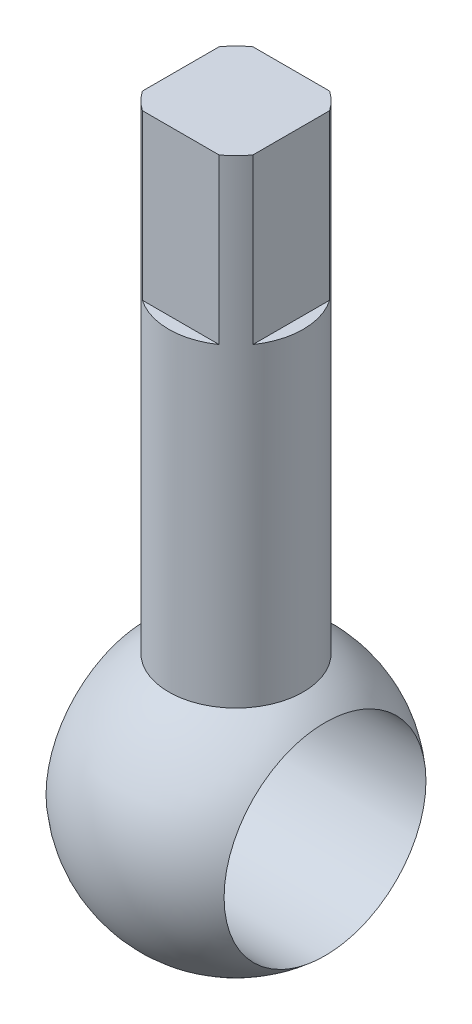
ISO-10303-21;
HEADER;
FILE_DESCRIPTION(('STEP AP214'),'2;1');
FILE_NAME('part.step','',(''),(''),'','','');
FILE_SCHEMA(('AUTOMOTIVE_DESIGN { 1 0 10303 214 1 1 1 1 }'));
ENDSEC;
DATA;
#1=APPLICATION_CONTEXT('core data for automotive mechanical design processes');
#2=APPLICATION_PROTOCOL_DEFINITION('international standard','automotive_design',2000,#1);
#3=PRODUCT_CONTEXT('',#1,'mechanical');
#4=PRODUCT('Part','Part','',(#3));
#5=PRODUCT_RELATED_PRODUCT_CATEGORY('part','',(#4));
#6=PRODUCT_DEFINITION_FORMATION('','',#4);
#7=PRODUCT_DEFINITION_CONTEXT('part definition',#1,'design');
#8=PRODUCT_DEFINITION('design','',#6,#7);
#9=PRODUCT_DEFINITION_SHAPE('','',#8);
#10=(LENGTH_UNIT() NAMED_UNIT(*) SI_UNIT(.MILLI.,.METRE.));
#11=(NAMED_UNIT(*) PLANE_ANGLE_UNIT() SI_UNIT($,.RADIAN.));
#12=(NAMED_UNIT(*) SI_UNIT($,.STERADIAN.) SOLID_ANGLE_UNIT());
#13=UNCERTAINTY_MEASURE_WITH_UNIT(LENGTH_MEASURE(1.E-05),#10,'distance_accuracy_value','');
#14=(GEOMETRIC_REPRESENTATION_CONTEXT(3) GLOBAL_UNCERTAINTY_ASSIGNED_CONTEXT((#13)) GLOBAL_UNIT_ASSIGNED_CONTEXT((#10,
#11,#12)) REPRESENTATION_CONTEXT('',''));
#15=CARTESIAN_POINT('',(0.,0.,0.));
#16=DIRECTION('',(0.,0.,1.));
#17=DIRECTION('',(1.,0.,0.));
#18=AXIS2_PLACEMENT_3D('',#15,#16,#17);
#19=CARTESIAN_POINT('',(0.,25.4,0.));
#20=DIRECTION('',(0.,-1.,0.));
#21=DIRECTION('',(-1.,0.,0.));
#22=AXIS2_PLACEMENT_3D('',#19,#20,#21);
#23=SPHERICAL_SURFACE('',#22,25.4);
#24=CARTESIAN_POINT('',(16.8005208252601,25.4,0.));
#25=DIRECTION('',(-1.,0.,0.));
#26=DIRECTION('',(0.,0.,1.));
#27=AXIS2_PLACEMENT_3D('',#24,#25,#26);
#28=CIRCLE('',#27,19.05);
#29=CARTESIAN_POINT('',(16.8005208252601,25.4,19.05));
#30=VERTEX_POINT('',#29);
#31=EDGE_CURVE('E37',#30,#30,#28,.T.);
#32=ORIENTED_EDGE('',*,*,#31,.T.);
#33=EDGE_LOOP('',(#32));
#34=FACE_BOUND('',#33,.T.);
#35=CARTESIAN_POINT('',(-16.8005208252601,25.4,0.));
#36=DIRECTION('',(1.,0.,0.));
#37=DIRECTION('',(0.,0.,-1.));
#38=AXIS2_PLACEMENT_3D('',#35,#36,#37);
#39=CIRCLE('',#38,19.05);
#40=CARTESIAN_POINT('',(-16.8005208252601,25.4,-19.05));
#41=VERTEX_POINT('',#40);
#42=EDGE_CURVE('E118',#41,#41,#39,.T.);
#43=ORIENTED_EDGE('',*,*,#42,.T.);
#44=EDGE_LOOP('',(#43));
#45=FACE_BOUND('',#44,.T.);
#46=CARTESIAN_POINT('',(0.,47.3970452561247,0.));
#47=DIRECTION('',(0.,-1.,0.));
#48=DIRECTION('',(0.,0.,-1.));
#49=AXIS2_PLACEMENT_3D('',#46,#47,#48);
#50=CIRCLE('',#49,12.7);
#51=CARTESIAN_POINT('',(0.,47.3970452561247,-12.7));
#52=VERTEX_POINT('',#51);
#53=EDGE_CURVE('E153',#52,#52,#50,.T.);
#54=ORIENTED_EDGE('',*,*,#53,.T.);
#55=EDGE_LOOP('',(#54));
#56=FACE_BOUND('',#55,.T.);
#57=ADVANCED_FACE('F34',(#34,#45,#56),#23,.T.);
#58=CARTESIAN_POINT('',(0.,137.668,0.));
#59=DIRECTION('',(0.,-1.,0.));
#60=DIRECTION('',(0.,0.,-1.));
#61=AXIS2_PLACEMENT_3D('',#58,#59,#60);
#62=PLANE('',#61);
#63=CARTESIAN_POINT('',(0.,137.668,0.));
#64=DIRECTION('',(0.,-1.,0.));
#65=DIRECTION('',(0.,0.,-1.));
#66=AXIS2_PLACEMENT_3D('',#63,#64,#65);
#67=CIRCLE('',#66,12.7);
#68=CARTESIAN_POINT('',(-7.239,137.668,10.4348875892364));
#69=VERTEX_POINT('',#68);
#70=CARTESIAN_POINT('',(-10.4348875892364,137.668,7.239));
#71=VERTEX_POINT('',#70);
#72=EDGE_CURVE('E186',#69,#71,#67,.T.);
#73=ORIENTED_EDGE('',*,*,#72,.F.);
#74=DIRECTION('',(-1.,0.,0.));
#75=VECTOR('',#74,1.);
#76=CARTESIAN_POINT('',(-7.239,137.668,10.4348875892364));
#77=LINE('',#76,#75);
#78=CARTESIAN_POINT('',(7.239,137.668,10.4348875892364));
#79=VERTEX_POINT('',#78);
#80=EDGE_CURVE('E104',#79,#69,#77,.T.);
#81=ORIENTED_EDGE('',*,*,#80,.F.);
#82=CARTESIAN_POINT('',(10.4348875892364,137.668,7.239));
#83=VERTEX_POINT('',#82);
#84=EDGE_CURVE('E42',#83,#79,#67,.T.);
#85=ORIENTED_EDGE('',*,*,#84,.F.);
#86=DIRECTION('',(0.,0.,1.));
#87=VECTOR('',#86,1.);
#88=CARTESIAN_POINT('',(10.4348875892364,137.668,-7.239));
#89=LINE('',#88,#87);
#90=CARTESIAN_POINT('',(10.4348875892364,137.668,-7.239));
#91=VERTEX_POINT('',#90);
#92=EDGE_CURVE('E147',#91,#83,#89,.T.);
#93=ORIENTED_EDGE('',*,*,#92,.F.);
#94=CARTESIAN_POINT('',(7.239,137.668,-10.4348875892364));
#95=VERTEX_POINT('',#94);
#96=EDGE_CURVE('E11',#95,#91,#67,.T.);
#97=ORIENTED_EDGE('',*,*,#96,.F.);
#98=DIRECTION('',(1.,0.,0.));
#99=VECTOR('',#98,1.);
#100=CARTESIAN_POINT('',(-7.239,137.668,-10.4348875892364));
#101=LINE('',#100,#99);
#102=CARTESIAN_POINT('',(-7.239,137.668,-10.4348875892364));
#103=VERTEX_POINT('',#102);
#104=EDGE_CURVE('E124',#103,#95,#101,.T.);
#105=ORIENTED_EDGE('',*,*,#104,.F.);
#106=CARTESIAN_POINT('',(-10.4348875892364,137.668,-7.239));
#107=VERTEX_POINT('',#106);
#108=EDGE_CURVE('E44',#107,#103,#67,.T.);
#109=ORIENTED_EDGE('',*,*,#108,.F.);
#110=DIRECTION('',(0.,0.,-1.));
#111=VECTOR('',#110,1.);
#112=CARTESIAN_POINT('',(-10.4348875892364,137.668,-7.239));
#113=LINE('',#112,#111);
#114=EDGE_CURVE('E136',#71,#107,#113,.T.);
#115=ORIENTED_EDGE('',*,*,#114,.F.);
#116=EDGE_LOOP('',(#73,#81,#85,#93,#97,#105,#109,#115));
#117=FACE_BOUND('',#116,.T.);
#118=ADVANCED_FACE('F174',(#117),#62,.F.);
#119=CARTESIAN_POINT('',(0.,0.,0.));
#120=DIRECTION('',(0.,-1.,0.));
#121=DIRECTION('',(0.,0.,-1.));
#122=AXIS2_PLACEMENT_3D('',#119,#120,#121);
#123=CYLINDRICAL_SURFACE('',#122,12.7);
#124=ORIENTED_EDGE('',*,*,#84,.T.);
#125=DIRECTION('',(0.,1.,0.));
#126=VECTOR('',#125,1.);
#127=CARTESIAN_POINT('',(7.239,106.68,10.4348875892364));
#128=LINE('',#127,#126);
#129=CARTESIAN_POINT('',(7.239,106.68,10.4348875892364));
#130=VERTEX_POINT('',#129);
#131=EDGE_CURVE('E108',#130,#79,#128,.T.);
#132=ORIENTED_EDGE('',*,*,#131,.F.);
#133=CARTESIAN_POINT('',(0.,106.68,0.));
#134=DIRECTION('',(0.,1.,0.));
#135=DIRECTION('',(0.,0.,1.));
#136=AXIS2_PLACEMENT_3D('',#133,#134,#135);
#137=CIRCLE('',#136,12.7);
#138=CARTESIAN_POINT('',(-7.239,106.68,10.4348875892364));
#139=VERTEX_POINT('',#138);
#140=EDGE_CURVE('E99',#139,#130,#137,.T.);
#141=ORIENTED_EDGE('',*,*,#140,.F.);
#142=DIRECTION('',(0.,1.,0.));
#143=VECTOR('',#142,1.);
#144=CARTESIAN_POINT('',(-7.239,106.68,10.4348875892364));
#145=LINE('',#144,#143);
#146=EDGE_CURVE('E110',#139,#69,#145,.T.);
#147=ORIENTED_EDGE('',*,*,#146,.T.);
#148=ORIENTED_EDGE('',*,*,#72,.T.);
#149=DIRECTION('',(0.,1.,0.));
#150=VECTOR('',#149,1.);
#151=CARTESIAN_POINT('',(-10.4348875892364,106.68,7.239));
#152=LINE('',#151,#150);
#153=CARTESIAN_POINT('',(-10.4348875892364,106.68,7.239));
#154=VERTEX_POINT('',#153);
#155=EDGE_CURVE('E138',#154,#71,#152,.T.);
#156=ORIENTED_EDGE('',*,*,#155,.F.);
#157=CARTESIAN_POINT('',(0.,106.68,0.));
#158=DIRECTION('',(0.,1.,0.));
#159=DIRECTION('',(0.,0.,1.));
#160=AXIS2_PLACEMENT_3D('',#157,#158,#159);
#161=CIRCLE('',#160,12.7);
#162=CARTESIAN_POINT('',(-10.4348875892364,106.68,-7.239));
#163=VERTEX_POINT('',#162);
#164=EDGE_CURVE('E133',#163,#154,#161,.T.);
#165=ORIENTED_EDGE('',*,*,#164,.F.);
#166=DIRECTION('',(0.,1.,0.));
#167=VECTOR('',#166,1.);
#168=CARTESIAN_POINT('',(-10.4348875892364,106.68,-7.239));
#169=LINE('',#168,#167);
#170=EDGE_CURVE('E128',#163,#107,#169,.T.);
#171=ORIENTED_EDGE('',*,*,#170,.T.);
#172=ORIENTED_EDGE('',*,*,#108,.T.);
#173=DIRECTION('',(0.,1.,0.));
#174=VECTOR('',#173,1.);
#175=CARTESIAN_POINT('',(-7.239,106.68,-10.4348875892364));
#176=LINE('',#175,#174);
#177=CARTESIAN_POINT('',(-7.239,106.68,-10.4348875892364));
#178=VERTEX_POINT('',#177);
#179=EDGE_CURVE('E126',#178,#103,#176,.T.);
#180=ORIENTED_EDGE('',*,*,#179,.F.);
#181=CARTESIAN_POINT('',(0.,106.68,0.));
#182=DIRECTION('',(0.,1.,0.));
#183=DIRECTION('',(0.,0.,1.));
#184=AXIS2_PLACEMENT_3D('',#181,#182,#183);
#185=CIRCLE('',#184,12.7);
#186=CARTESIAN_POINT('',(7.239,106.68,-10.4348875892364));
#187=VERTEX_POINT('',#186);
#188=EDGE_CURVE('E122',#187,#178,#185,.T.);
#189=ORIENTED_EDGE('',*,*,#188,.F.);
#190=DIRECTION('',(0.,1.,0.));
#191=VECTOR('',#190,1.);
#192=CARTESIAN_POINT('',(7.239,106.68,-10.4348875892364));
#193=LINE('',#192,#191);
#194=EDGE_CURVE('E129',#187,#95,#193,.T.);
#195=ORIENTED_EDGE('',*,*,#194,.T.);
#196=ORIENTED_EDGE('',*,*,#96,.T.);
#197=DIRECTION('',(0.,1.,0.));
#198=VECTOR('',#197,1.);
#199=CARTESIAN_POINT('',(10.4348875892364,106.68,-7.239));
#200=LINE('',#199,#198);
#201=CARTESIAN_POINT('',(10.4348875892364,106.68,-7.239));
#202=VERTEX_POINT('',#201);
#203=EDGE_CURVE('E149',#202,#91,#200,.T.);
#204=ORIENTED_EDGE('',*,*,#203,.F.);
#205=CARTESIAN_POINT('',(0.,106.68,0.));
#206=DIRECTION('',(0.,1.,0.));
#207=DIRECTION('',(0.,0.,1.));
#208=AXIS2_PLACEMENT_3D('',#205,#206,#207);
#209=CIRCLE('',#208,12.7);
#210=CARTESIAN_POINT('',(10.4348875892364,106.68,7.239));
#211=VERTEX_POINT('',#210);
#212=EDGE_CURVE('E144',#211,#202,#209,.T.);
#213=ORIENTED_EDGE('',*,*,#212,.F.);
#214=DIRECTION('',(0.,1.,0.));
#215=VECTOR('',#214,1.);
#216=CARTESIAN_POINT('',(10.4348875892364,106.68,7.239));
#217=LINE('',#216,#215);
#218=EDGE_CURVE('E140',#211,#83,#217,.T.);
#219=ORIENTED_EDGE('',*,*,#218,.T.);
#220=EDGE_LOOP('',(#124,#132,#141,#147,#148,#156,#165,#171,#172,#180,#189,#195,#196,#204,#213,#219));
#221=FACE_BOUND('',#220,.T.);
#222=ORIENTED_EDGE('',*,*,#53,.F.);
#223=EDGE_LOOP('',(#222));
#224=FACE_BOUND('',#223,.T.);
#225=ADVANCED_FACE('F113',(#221,#224),#123,.T.);
#226=CARTESIAN_POINT('',(-25.4,25.4,0.));
#227=DIRECTION('',(1.,0.,0.));
#228=DIRECTION('',(0.,0.,-1.));
#229=AXIS2_PLACEMENT_3D('',#226,#227,#228);
#230=CYLINDRICAL_SURFACE('',#229,19.05);
#231=ORIENTED_EDGE('',*,*,#42,.F.);
#232=EDGE_LOOP('',(#231));
#233=FACE_BOUND('',#232,.T.);
#234=ORIENTED_EDGE('',*,*,#31,.F.);
#235=EDGE_LOOP('',(#234));
#236=FACE_BOUND('',#235,.T.);
#237=ADVANCED_FACE('F162',(#233,#236),#230,.F.);
#238=CARTESIAN_POINT('',(10.4348875892364,106.68,-7.239));
#239=DIRECTION('',(-1.,0.,0.));
#240=DIRECTION('',(0.,0.,1.));
#241=AXIS2_PLACEMENT_3D('',#238,#239,#240);
#242=PLANE('',#241);
#243=ORIENTED_EDGE('',*,*,#92,.T.);
#244=ORIENTED_EDGE('',*,*,#218,.F.);
#245=DIRECTION('',(0.,0.,1.));
#246=VECTOR('',#245,1.);
#247=CARTESIAN_POINT('',(10.4348875892364,106.68,-7.239));
#248=LINE('',#247,#246);
#249=EDGE_CURVE('E146',#202,#211,#248,.T.);
#250=ORIENTED_EDGE('',*,*,#249,.F.);
#251=ORIENTED_EDGE('',*,*,#203,.T.);
#252=EDGE_LOOP('',(#243,#244,#250,#251));
#253=FACE_BOUND('',#252,.T.);
#254=ADVANCED_FACE('F164',(#253),#242,.F.);
#255=CARTESIAN_POINT('',(0.,106.68,0.));
#256=DIRECTION('',(0.,1.,0.));
#257=DIRECTION('',(0.,0.,1.));
#258=AXIS2_PLACEMENT_3D('',#255,#256,#257);
#259=PLANE('',#258);
#260=ORIENTED_EDGE('',*,*,#212,.T.);
#261=ORIENTED_EDGE('',*,*,#249,.T.);
#262=EDGE_LOOP('',(#260,#261));
#263=FACE_BOUND('',#262,.T.);
#264=ADVANCED_FACE('F171',(#263),#259,.T.);
#265=CARTESIAN_POINT('',(-10.4348875892364,106.68,-7.239));
#266=DIRECTION('',(1.,0.,0.));
#267=DIRECTION('',(0.,0.,-1.));
#268=AXIS2_PLACEMENT_3D('',#265,#266,#267);
#269=PLANE('',#268);
#270=ORIENTED_EDGE('',*,*,#114,.T.);
#271=ORIENTED_EDGE('',*,*,#170,.F.);
#272=DIRECTION('',(0.,0.,-1.));
#273=VECTOR('',#272,1.);
#274=CARTESIAN_POINT('',(-10.4348875892364,106.68,-7.239));
#275=LINE('',#274,#273);
#276=EDGE_CURVE('E135',#154,#163,#275,.T.);
#277=ORIENTED_EDGE('',*,*,#276,.F.);
#278=ORIENTED_EDGE('',*,*,#155,.T.);
#279=EDGE_LOOP('',(#270,#271,#277,#278));
#280=FACE_BOUND('',#279,.T.);
#281=ADVANCED_FACE('F214',(#280),#269,.F.);
#282=CARTESIAN_POINT('',(0.,106.68,0.));
#283=DIRECTION('',(0.,1.,0.));
#284=DIRECTION('',(0.,0.,1.));
#285=AXIS2_PLACEMENT_3D('',#282,#283,#284);
#286=PLANE('',#285);
#287=ORIENTED_EDGE('',*,*,#164,.T.);
#288=ORIENTED_EDGE('',*,*,#276,.T.);
#289=EDGE_LOOP('',(#287,#288));
#290=FACE_BOUND('',#289,.T.);
#291=ADVANCED_FACE('F208',(#290),#286,.T.);
#292=CARTESIAN_POINT('',(-7.239,106.68,-10.4348875892364));
#293=DIRECTION('',(0.,0.,1.));
#294=DIRECTION('',(1.,0.,0.));
#295=AXIS2_PLACEMENT_3D('',#292,#293,#294);
#296=PLANE('',#295);
#297=ORIENTED_EDGE('',*,*,#104,.T.);
#298=ORIENTED_EDGE('',*,*,#194,.F.);
#299=DIRECTION('',(1.,0.,0.));
#300=VECTOR('',#299,1.);
#301=CARTESIAN_POINT('',(-7.239,106.68,-10.4348875892364));
#302=LINE('',#301,#300);
#303=EDGE_CURVE('E57',#178,#187,#302,.T.);
#304=ORIENTED_EDGE('',*,*,#303,.F.);
#305=ORIENTED_EDGE('',*,*,#179,.T.);
#306=EDGE_LOOP('',(#297,#298,#304,#305));
#307=FACE_BOUND('',#306,.T.);
#308=ADVANCED_FACE('F198',(#307),#296,.F.);
#309=CARTESIAN_POINT('',(0.,106.68,0.));
#310=DIRECTION('',(0.,1.,0.));
#311=DIRECTION('',(0.,0.,1.));
#312=AXIS2_PLACEMENT_3D('',#309,#310,#311);
#313=PLANE('',#312);
#314=ORIENTED_EDGE('',*,*,#188,.T.);
#315=ORIENTED_EDGE('',*,*,#303,.T.);
#316=EDGE_LOOP('',(#314,#315));
#317=FACE_BOUND('',#316,.T.);
#318=ADVANCED_FACE('F200',(#317),#313,.T.);
#319=CARTESIAN_POINT('',(-7.239,106.68,10.4348875892364));
#320=DIRECTION('',(0.,0.,-1.));
#321=DIRECTION('',(-1.,0.,0.));
#322=AXIS2_PLACEMENT_3D('',#319,#320,#321);
#323=PLANE('',#322);
#324=ORIENTED_EDGE('',*,*,#80,.T.);
#325=ORIENTED_EDGE('',*,*,#146,.F.);
#326=DIRECTION('',(-1.,0.,0.));
#327=VECTOR('',#326,1.);
#328=CARTESIAN_POINT('',(-7.239,106.68,10.4348875892364));
#329=LINE('',#328,#327);
#330=EDGE_CURVE('E50',#130,#139,#329,.T.);
#331=ORIENTED_EDGE('',*,*,#330,.F.);
#332=ORIENTED_EDGE('',*,*,#131,.T.);
#333=EDGE_LOOP('',(#324,#325,#331,#332));
#334=FACE_BOUND('',#333,.T.);
#335=ADVANCED_FACE('F107',(#334),#323,.F.);
#336=CARTESIAN_POINT('',(0.,106.68,0.));
#337=DIRECTION('',(0.,1.,0.));
#338=DIRECTION('',(0.,0.,1.));
#339=AXIS2_PLACEMENT_3D('',#336,#337,#338);
#340=PLANE('',#339);
#341=ORIENTED_EDGE('',*,*,#140,.T.);
#342=ORIENTED_EDGE('',*,*,#330,.T.);
#343=EDGE_LOOP('',(#341,#342));
#344=FACE_BOUND('',#343,.T.);
#345=ADVANCED_FACE('F100',(#344),#340,.T.);
#346=CLOSED_SHELL('',(#57,#118,#225,#237,#254,#264,#281,#291,#308,#318,#335,#345));
#347=MANIFOLD_SOLID_BREP('B2',#346);
#348=ADVANCED_BREP_SHAPE_REPRESENTATION('',(#18,#347),#14);
#349=SHAPE_DEFINITION_REPRESENTATION(#9,#348);
ENDSEC;
END-ISO-10303-21;
